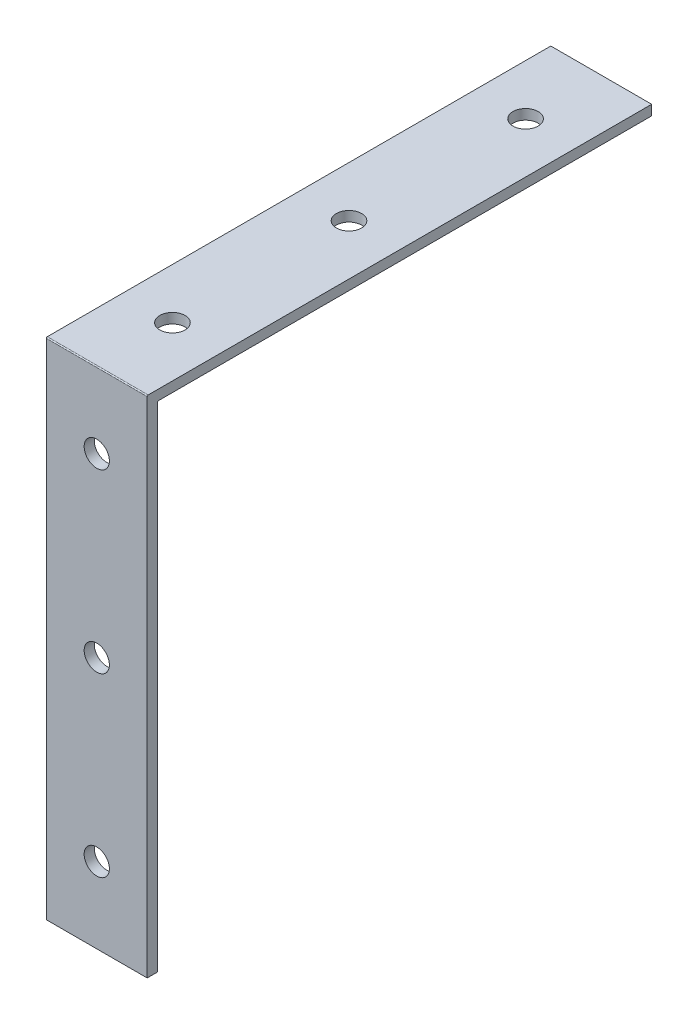
ISO-10303-21;
HEADER;
FILE_DESCRIPTION(('STEP AP214'),'2;1');
FILE_NAME('part.step','',(''),(''),'','','');
FILE_SCHEMA(('AUTOMOTIVE_DESIGN { 1 0 10303 214 1 1 1 1 }'));
ENDSEC;
DATA;
#1=APPLICATION_CONTEXT('core data for automotive mechanical design processes');
#2=APPLICATION_PROTOCOL_DEFINITION('international standard','automotive_design',2000,#1);
#3=PRODUCT_CONTEXT('',#1,'mechanical');
#4=PRODUCT('Part','Part','',(#3));
#5=PRODUCT_RELATED_PRODUCT_CATEGORY('part','',(#4));
#6=PRODUCT_DEFINITION_FORMATION('','',#4);
#7=PRODUCT_DEFINITION_CONTEXT('part definition',#1,'design');
#8=PRODUCT_DEFINITION('design','',#6,#7);
#9=PRODUCT_DEFINITION_SHAPE('','',#8);
#10=(LENGTH_UNIT() NAMED_UNIT(*) SI_UNIT(.MILLI.,.METRE.));
#11=(NAMED_UNIT(*) PLANE_ANGLE_UNIT() SI_UNIT($,.RADIAN.));
#12=(NAMED_UNIT(*) SI_UNIT($,.STERADIAN.) SOLID_ANGLE_UNIT());
#13=UNCERTAINTY_MEASURE_WITH_UNIT(LENGTH_MEASURE(1.E-05),#10,'distance_accuracy_value','');
#14=(GEOMETRIC_REPRESENTATION_CONTEXT(3) GLOBAL_UNCERTAINTY_ASSIGNED_CONTEXT((#13)) GLOBAL_UNIT_ASSIGNED_CONTEXT((#10,
#11,#12)) REPRESENTATION_CONTEXT('',''));
#15=CARTESIAN_POINT('',(0.,0.,0.));
#16=DIRECTION('',(0.,0.,1.));
#17=DIRECTION('',(1.,0.,0.));
#18=AXIS2_PLACEMENT_3D('',#15,#16,#17);
#19=CARTESIAN_POINT('',(20.,-2.,-100.));
#20=DIRECTION('',(0.,0.,1.));
#21=DIRECTION('',(1.,0.,0.));
#22=AXIS2_PLACEMENT_3D('',#19,#20,#21);
#23=PLANE('',#22);
#24=DIRECTION('',(0.,1.,0.));
#25=VECTOR('',#24,1.);
#26=CARTESIAN_POINT('',(0.,-2.,-100.));
#27=LINE('',#26,#25);
#28=CARTESIAN_POINT('',(0.,-2.,-100.));
#29=VERTEX_POINT('',#28);
#30=CARTESIAN_POINT('',(0.,0.,-100.));
#31=VERTEX_POINT('',#30);
#32=EDGE_CURVE('E129',#29,#31,#27,.T.);
#33=ORIENTED_EDGE('',*,*,#32,.T.);
#34=DIRECTION('',(-1.,0.,0.));
#35=VECTOR('',#34,1.);
#36=CARTESIAN_POINT('',(20.,0.,-100.));
#37=LINE('',#36,#35);
#38=CARTESIAN_POINT('',(20.,0.,-100.));
#39=VERTEX_POINT('',#38);
#40=EDGE_CURVE('E11',#39,#31,#37,.T.);
#41=ORIENTED_EDGE('',*,*,#40,.F.);
#42=DIRECTION('',(0.,1.,0.));
#43=VECTOR('',#42,1.);
#44=CARTESIAN_POINT('',(20.,-2.,-100.));
#45=LINE('',#44,#43);
#46=CARTESIAN_POINT('',(20.,-2.,-100.));
#47=VERTEX_POINT('',#46);
#48=EDGE_CURVE('E144',#47,#39,#45,.T.);
#49=ORIENTED_EDGE('',*,*,#48,.F.);
#50=DIRECTION('',(-1.,0.,0.));
#51=VECTOR('',#50,1.);
#52=CARTESIAN_POINT('',(20.,-2.,-100.));
#53=LINE('',#52,#51);
#54=EDGE_CURVE('E125',#47,#29,#53,.T.);
#55=ORIENTED_EDGE('',*,*,#54,.T.);
#56=EDGE_LOOP('',(#33,#41,#49,#55));
#57=FACE_BOUND('',#56,.T.);
#58=ADVANCED_FACE('F33',(#57),#23,.F.);
#59=CARTESIAN_POINT('',(20.,0.,-100.));
#60=DIRECTION('',(0.,-1.,0.));
#61=DIRECTION('',(0.,0.,-1.));
#62=AXIS2_PLACEMENT_3D('',#59,#60,#61);
#63=PLANE('',#62);
#64=CARTESIAN_POINT('',(10.,0.,-15.));
#65=DIRECTION('',(0.,1.,0.));
#66=DIRECTION('',(0.,0.,1.));
#67=AXIS2_PLACEMENT_3D('',#64,#65,#66);
#68=CIRCLE('',#67,2.50000000000001);
#69=CARTESIAN_POINT('',(10.,0.,-12.5));
#70=VERTEX_POINT('',#69);
#71=EDGE_CURVE('E191',#70,#70,#68,.T.);
#72=ORIENTED_EDGE('',*,*,#71,.F.);
#73=EDGE_LOOP('',(#72));
#74=FACE_BOUND('',#73,.T.);
#75=CARTESIAN_POINT('',(10.,0.,-50.));
#76=DIRECTION('',(0.,1.,0.));
#77=DIRECTION('',(0.,0.,1.));
#78=AXIS2_PLACEMENT_3D('',#75,#76,#77);
#79=CIRCLE('',#78,2.50000000000001);
#80=CARTESIAN_POINT('',(10.,0.,-47.5));
#81=VERTEX_POINT('',#80);
#82=EDGE_CURVE('E185',#81,#81,#79,.T.);
#83=ORIENTED_EDGE('',*,*,#82,.F.);
#84=EDGE_LOOP('',(#83));
#85=FACE_BOUND('',#84,.T.);
#86=CARTESIAN_POINT('',(10.,0.,-85.));
#87=DIRECTION('',(0.,1.,0.));
#88=DIRECTION('',(0.,0.,1.));
#89=AXIS2_PLACEMENT_3D('',#86,#87,#88);
#90=CIRCLE('',#89,2.50000000000001);
#91=CARTESIAN_POINT('',(10.,0.,-82.5));
#92=VERTEX_POINT('',#91);
#93=EDGE_CURVE('E179',#92,#92,#90,.T.);
#94=ORIENTED_EDGE('',*,*,#93,.F.);
#95=EDGE_LOOP('',(#94));
#96=FACE_BOUND('',#95,.T.);
#97=DIRECTION('',(0.,0.,1.));
#98=VECTOR('',#97,1.);
#99=CARTESIAN_POINT('',(0.,0.,-100.));
#100=LINE('',#99,#98);
#101=CARTESIAN_POINT('',(0.,0.,-0.199999999999996));
#102=VERTEX_POINT('',#101);
#103=EDGE_CURVE('E132',#31,#102,#100,.T.);
#104=ORIENTED_EDGE('',*,*,#103,.T.);
#105=DIRECTION('',(-1.,0.,0.));
#106=VECTOR('',#105,1.);
#107=CARTESIAN_POINT('',(20.,0.,-0.199999999999996));
#108=LINE('',#107,#106);
#109=CARTESIAN_POINT('',(20.,0.,-0.199999999999996));
#110=VERTEX_POINT('',#109);
#111=EDGE_CURVE('E41',#110,#102,#108,.T.);
#112=ORIENTED_EDGE('',*,*,#111,.F.);
#113=DIRECTION('',(0.,0.,1.));
#114=VECTOR('',#113,1.);
#115=CARTESIAN_POINT('',(20.,0.,-100.));
#116=LINE('',#115,#114);
#117=EDGE_CURVE('E92',#39,#110,#116,.T.);
#118=ORIENTED_EDGE('',*,*,#117,.F.);
#119=ORIENTED_EDGE('',*,*,#40,.T.);
#120=EDGE_LOOP('',(#104,#112,#118,#119));
#121=FACE_BOUND('',#120,.T.);
#122=ADVANCED_FACE('F243',(#74,#85,#96,#121),#63,.F.);
#123=CARTESIAN_POINT('',(20.,-0.200000000000005,-0.2));
#124=DIRECTION('',(-1.,0.,0.));
#125=DIRECTION('',(0.,0.,1.));
#126=AXIS2_PLACEMENT_3D('',#123,#124,#125);
#127=CYLINDRICAL_SURFACE('',#126,0.200000000000002);
#128=CARTESIAN_POINT('',(0.,-0.200000000000005,-0.2));
#129=DIRECTION('',(1.,0.,0.));
#130=DIRECTION('',(0.,0.,-1.));
#131=AXIS2_PLACEMENT_3D('',#128,#129,#130);
#132=CIRCLE('',#131,0.200000000000002);
#133=CARTESIAN_POINT('',(0.,-0.200000000000005,0.));
#134=VERTEX_POINT('',#133);
#135=EDGE_CURVE('E135',#102,#134,#132,.T.);
#136=ORIENTED_EDGE('',*,*,#135,.T.);
#137=DIRECTION('',(-1.,0.,0.));
#138=VECTOR('',#137,1.);
#139=CARTESIAN_POINT('',(20.,-0.200000000000005,0.));
#140=LINE('',#139,#138);
#141=CARTESIAN_POINT('',(20.,-0.200000000000005,0.));
#142=VERTEX_POINT('',#141);
#143=EDGE_CURVE('E151',#142,#134,#140,.T.);
#144=ORIENTED_EDGE('',*,*,#143,.F.);
#145=CARTESIAN_POINT('',(20.,-0.200000000000005,-0.2));
#146=DIRECTION('',(1.,0.,0.));
#147=DIRECTION('',(0.,0.,-1.));
#148=AXIS2_PLACEMENT_3D('',#145,#146,#147);
#149=CIRCLE('',#148,0.200000000000002);
#150=EDGE_CURVE('E159',#110,#142,#149,.T.);
#151=ORIENTED_EDGE('',*,*,#150,.F.);
#152=ORIENTED_EDGE('',*,*,#111,.T.);
#153=EDGE_LOOP('',(#136,#144,#151,#152));
#154=FACE_BOUND('',#153,.T.);
#155=ADVANCED_FACE('F157',(#154),#127,.T.);
#156=CARTESIAN_POINT('',(20.,-0.200000000000005,0.));
#157=DIRECTION('',(0.,0.,-1.));
#158=DIRECTION('',(0.,1.,0.));
#159=AXIS2_PLACEMENT_3D('',#156,#157,#158);
#160=PLANE('',#159);
#161=CARTESIAN_POINT('',(10.,-85.,0.));
#162=DIRECTION('',(0.,0.,1.));
#163=DIRECTION('',(1.,0.,0.));
#164=AXIS2_PLACEMENT_3D('',#161,#162,#163);
#165=CIRCLE('',#164,2.50000000000001);
#166=CARTESIAN_POINT('',(12.5,-85.,0.));
#167=VERTEX_POINT('',#166);
#168=EDGE_CURVE('E209',#167,#167,#165,.T.);
#169=ORIENTED_EDGE('',*,*,#168,.F.);
#170=EDGE_LOOP('',(#169));
#171=FACE_BOUND('',#170,.T.);
#172=CARTESIAN_POINT('',(10.,-50.,0.));
#173=DIRECTION('',(0.,0.,1.));
#174=DIRECTION('',(1.,0.,0.));
#175=AXIS2_PLACEMENT_3D('',#172,#173,#174);
#176=CIRCLE('',#175,2.50000000000001);
#177=CARTESIAN_POINT('',(12.5,-50.,0.));
#178=VERTEX_POINT('',#177);
#179=EDGE_CURVE('E203',#178,#178,#176,.T.);
#180=ORIENTED_EDGE('',*,*,#179,.F.);
#181=EDGE_LOOP('',(#180));
#182=FACE_BOUND('',#181,.T.);
#183=CARTESIAN_POINT('',(10.,-15.,0.));
#184=DIRECTION('',(0.,0.,1.));
#185=DIRECTION('',(1.,0.,0.));
#186=AXIS2_PLACEMENT_3D('',#183,#184,#185);
#187=CIRCLE('',#186,2.50000000000001);
#188=CARTESIAN_POINT('',(12.5,-15.,0.));
#189=VERTEX_POINT('',#188);
#190=EDGE_CURVE('E197',#189,#189,#187,.T.);
#191=ORIENTED_EDGE('',*,*,#190,.F.);
#192=EDGE_LOOP('',(#191));
#193=FACE_BOUND('',#192,.T.);
#194=DIRECTION('',(0.,-1.,0.));
#195=VECTOR('',#194,1.);
#196=CARTESIAN_POINT('',(0.,-0.200000000000005,0.));
#197=LINE('',#196,#195);
#198=CARTESIAN_POINT('',(0.,-100.,0.));
#199=VERTEX_POINT('',#198);
#200=EDGE_CURVE('E137',#134,#199,#197,.T.);
#201=ORIENTED_EDGE('',*,*,#200,.T.);
#202=DIRECTION('',(-1.,0.,0.));
#203=VECTOR('',#202,1.);
#204=CARTESIAN_POINT('',(20.,-100.,0.));
#205=LINE('',#204,#203);
#206=CARTESIAN_POINT('',(20.,-100.,0.));
#207=VERTEX_POINT('',#206);
#208=EDGE_CURVE('E148',#207,#199,#205,.T.);
#209=ORIENTED_EDGE('',*,*,#208,.F.);
#210=DIRECTION('',(0.,-1.,0.));
#211=VECTOR('',#210,1.);
#212=CARTESIAN_POINT('',(20.,-0.200000000000005,0.));
#213=LINE('',#212,#211);
#214=EDGE_CURVE('E171',#142,#207,#213,.T.);
#215=ORIENTED_EDGE('',*,*,#214,.F.);
#216=ORIENTED_EDGE('',*,*,#143,.T.);
#217=EDGE_LOOP('',(#201,#209,#215,#216));
#218=FACE_BOUND('',#217,.T.);
#219=ADVANCED_FACE('F167',(#171,#182,#193,#218),#160,.F.);
#220=CARTESIAN_POINT('',(20.,-100.,0.));
#221=DIRECTION('',(0.,1.,0.));
#222=DIRECTION('',(0.,0.,1.));
#223=AXIS2_PLACEMENT_3D('',#220,#221,#222);
#224=PLANE('',#223);
#225=DIRECTION('',(0.,0.,-1.));
#226=VECTOR('',#225,1.);
#227=CARTESIAN_POINT('',(0.,-100.,0.));
#228=LINE('',#227,#226);
#229=CARTESIAN_POINT('',(0.,-100.,-1.99999999999999));
#230=VERTEX_POINT('',#229);
#231=EDGE_CURVE('E139',#199,#230,#228,.T.);
#232=ORIENTED_EDGE('',*,*,#231,.T.);
#233=DIRECTION('',(-1.,0.,0.));
#234=VECTOR('',#233,1.);
#235=CARTESIAN_POINT('',(20.,-100.,-1.99999999999999));
#236=LINE('',#235,#234);
#237=CARTESIAN_POINT('',(20.,-100.,-1.99999999999999));
#238=VERTEX_POINT('',#237);
#239=EDGE_CURVE('E120',#238,#230,#236,.T.);
#240=ORIENTED_EDGE('',*,*,#239,.F.);
#241=DIRECTION('',(0.,0.,-1.));
#242=VECTOR('',#241,1.);
#243=CARTESIAN_POINT('',(20.,-100.,0.));
#244=LINE('',#243,#242);
#245=EDGE_CURVE('E111',#207,#238,#244,.T.);
#246=ORIENTED_EDGE('',*,*,#245,.F.);
#247=ORIENTED_EDGE('',*,*,#208,.T.);
#248=EDGE_LOOP('',(#232,#240,#246,#247));
#249=FACE_BOUND('',#248,.T.);
#250=ADVANCED_FACE('F170',(#249),#224,.F.);
#251=CARTESIAN_POINT('',(20.,-100.,-1.99999999999999));
#252=DIRECTION('',(0.,0.,1.));
#253=DIRECTION('',(1.,0.,0.));
#254=AXIS2_PLACEMENT_3D('',#251,#252,#253);
#255=PLANE('',#254);
#256=CARTESIAN_POINT('',(10.,-85.,-1.99999999999999));
#257=DIRECTION('',(0.,0.,1.));
#258=DIRECTION('',(1.,0.,0.));
#259=AXIS2_PLACEMENT_3D('',#256,#257,#258);
#260=CIRCLE('',#259,2.50000000000001);
#261=CARTESIAN_POINT('',(12.5,-85.,-1.99999999999999));
#262=VERTEX_POINT('',#261);
#263=EDGE_CURVE('E206',#262,#262,#260,.T.);
#264=ORIENTED_EDGE('',*,*,#263,.T.);
#265=EDGE_LOOP('',(#264));
#266=FACE_BOUND('',#265,.T.);
#267=CARTESIAN_POINT('',(10.,-50.,-1.99999999999999));
#268=DIRECTION('',(0.,0.,1.));
#269=DIRECTION('',(1.,0.,0.));
#270=AXIS2_PLACEMENT_3D('',#267,#268,#269);
#271=CIRCLE('',#270,2.50000000000001);
#272=CARTESIAN_POINT('',(12.5,-50.,-1.99999999999999));
#273=VERTEX_POINT('',#272);
#274=EDGE_CURVE('E200',#273,#273,#271,.T.);
#275=ORIENTED_EDGE('',*,*,#274,.T.);
#276=EDGE_LOOP('',(#275));
#277=FACE_BOUND('',#276,.T.);
#278=CARTESIAN_POINT('',(10.,-15.,-1.99999999999999));
#279=DIRECTION('',(0.,0.,1.));
#280=DIRECTION('',(1.,0.,0.));
#281=AXIS2_PLACEMENT_3D('',#278,#279,#280);
#282=CIRCLE('',#281,2.50000000000001);
#283=CARTESIAN_POINT('',(12.5,-15.,-1.99999999999999));
#284=VERTEX_POINT('',#283);
#285=EDGE_CURVE('E194',#284,#284,#282,.T.);
#286=ORIENTED_EDGE('',*,*,#285,.T.);
#287=EDGE_LOOP('',(#286));
#288=FACE_BOUND('',#287,.T.);
#289=DIRECTION('',(0.,1.,0.));
#290=VECTOR('',#289,1.);
#291=CARTESIAN_POINT('',(0.,-100.,-1.99999999999999));
#292=LINE('',#291,#290);
#293=CARTESIAN_POINT('',(0.,-2.20000000000001,-1.99999999999999));
#294=VERTEX_POINT('',#293);
#295=EDGE_CURVE('E119',#230,#294,#292,.T.);
#296=ORIENTED_EDGE('',*,*,#295,.T.);
#297=DIRECTION('',(-1.,0.,0.));
#298=VECTOR('',#297,1.);
#299=CARTESIAN_POINT('',(20.,-2.20000000000001,-1.99999999999999));
#300=LINE('',#299,#298);
#301=CARTESIAN_POINT('',(20.,-2.20000000000001,-1.99999999999999));
#302=VERTEX_POINT('',#301);
#303=EDGE_CURVE('E116',#302,#294,#300,.T.);
#304=ORIENTED_EDGE('',*,*,#303,.F.);
#305=DIRECTION('',(0.,1.,0.));
#306=VECTOR('',#305,1.);
#307=CARTESIAN_POINT('',(20.,-100.,-1.99999999999999));
#308=LINE('',#307,#306);
#309=EDGE_CURVE('E105',#238,#302,#308,.T.);
#310=ORIENTED_EDGE('',*,*,#309,.F.);
#311=ORIENTED_EDGE('',*,*,#239,.T.);
#312=EDGE_LOOP('',(#296,#304,#310,#311));
#313=FACE_BOUND('',#312,.T.);
#314=ADVANCED_FACE('F117',(#266,#277,#288,#313),#255,.F.);
#315=CARTESIAN_POINT('',(20.,-2.20000000000001,-2.19999999999999));
#316=DIRECTION('',(-1.,0.,0.));
#317=DIRECTION('',(0.,0.,1.));
#318=AXIS2_PLACEMENT_3D('',#315,#316,#317);
#319=CYLINDRICAL_SURFACE('',#318,0.2);
#320=CARTESIAN_POINT('',(0.,-2.20000000000001,-2.19999999999999));
#321=DIRECTION('',(-1.,0.,0.));
#322=DIRECTION('',(0.,0.,-1.));
#323=AXIS2_PLACEMENT_3D('',#320,#321,#322);
#324=CIRCLE('',#323,0.2);
#325=CARTESIAN_POINT('',(0.,-2.00000000000001,-2.19999999999999));
#326=VERTEX_POINT('',#325);
#327=EDGE_CURVE('E78',#294,#326,#324,.T.);
#328=ORIENTED_EDGE('',*,*,#327,.T.);
#329=DIRECTION('',(-1.,0.,0.));
#330=VECTOR('',#329,1.);
#331=CARTESIAN_POINT('',(20.,-2.00000000000001,-2.19999999999999));
#332=LINE('',#331,#330);
#333=CARTESIAN_POINT('',(20.,-2.00000000000001,-2.19999999999999));
#334=VERTEX_POINT('',#333);
#335=EDGE_CURVE('E121',#334,#326,#332,.T.);
#336=ORIENTED_EDGE('',*,*,#335,.F.);
#337=CARTESIAN_POINT('',(20.,-2.20000000000001,-2.19999999999999));
#338=DIRECTION('',(-1.,0.,0.));
#339=DIRECTION('',(0.,0.,-1.));
#340=AXIS2_PLACEMENT_3D('',#337,#338,#339);
#341=CIRCLE('',#340,0.2);
#342=EDGE_CURVE('E109',#302,#334,#341,.T.);
#343=ORIENTED_EDGE('',*,*,#342,.F.);
#344=ORIENTED_EDGE('',*,*,#303,.T.);
#345=EDGE_LOOP('',(#328,#336,#343,#344));
#346=FACE_BOUND('',#345,.T.);
#347=ADVANCED_FACE('F123',(#346),#319,.F.);
#348=CARTESIAN_POINT('',(20.,-2.00000000000001,-2.19999999999999));
#349=DIRECTION('',(0.,1.,0.));
#350=DIRECTION('',(0.,0.,1.));
#351=AXIS2_PLACEMENT_3D('',#348,#349,#350);
#352=PLANE('',#351);
#353=CARTESIAN_POINT('',(10.,-2.00000000000001,-15.));
#354=DIRECTION('',(0.,1.,0.));
#355=DIRECTION('',(0.,0.,1.));
#356=AXIS2_PLACEMENT_3D('',#353,#354,#355);
#357=CIRCLE('',#356,2.50000000000001);
#358=CARTESIAN_POINT('',(10.,-2.00000000000001,-12.5));
#359=VERTEX_POINT('',#358);
#360=EDGE_CURVE('E188',#359,#359,#357,.T.);
#361=ORIENTED_EDGE('',*,*,#360,.T.);
#362=EDGE_LOOP('',(#361));
#363=FACE_BOUND('',#362,.T.);
#364=CARTESIAN_POINT('',(10.,-2.,-50.));
#365=DIRECTION('',(0.,1.,0.));
#366=DIRECTION('',(0.,0.,1.));
#367=AXIS2_PLACEMENT_3D('',#364,#365,#366);
#368=CIRCLE('',#367,2.50000000000001);
#369=CARTESIAN_POINT('',(10.,-2.,-47.5));
#370=VERTEX_POINT('',#369);
#371=EDGE_CURVE('E182',#370,#370,#368,.T.);
#372=ORIENTED_EDGE('',*,*,#371,.T.);
#373=EDGE_LOOP('',(#372));
#374=FACE_BOUND('',#373,.T.);
#375=CARTESIAN_POINT('',(10.,-2.,-85.));
#376=DIRECTION('',(0.,1.,0.));
#377=DIRECTION('',(0.,0.,1.));
#378=AXIS2_PLACEMENT_3D('',#375,#376,#377);
#379=CIRCLE('',#378,2.50000000000001);
#380=CARTESIAN_POINT('',(10.,-2.,-82.5));
#381=VERTEX_POINT('',#380);
#382=EDGE_CURVE('E133',#381,#381,#379,.T.);
#383=ORIENTED_EDGE('',*,*,#382,.T.);
#384=EDGE_LOOP('',(#383));
#385=FACE_BOUND('',#384,.T.);
#386=DIRECTION('',(0.,0.,-1.));
#387=VECTOR('',#386,1.);
#388=CARTESIAN_POINT('',(0.,-2.00000000000001,-2.19999999999999));
#389=LINE('',#388,#387);
#390=EDGE_CURVE('E84',#326,#29,#389,.T.);
#391=ORIENTED_EDGE('',*,*,#390,.T.);
#392=ORIENTED_EDGE('',*,*,#54,.F.);
#393=DIRECTION('',(0.,0.,-1.));
#394=VECTOR('',#393,1.);
#395=CARTESIAN_POINT('',(20.,-2.00000000000001,-2.19999999999999));
#396=LINE('',#395,#394);
#397=EDGE_CURVE('E49',#334,#47,#396,.T.);
#398=ORIENTED_EDGE('',*,*,#397,.F.);
#399=ORIENTED_EDGE('',*,*,#335,.T.);
#400=EDGE_LOOP('',(#391,#392,#398,#399));
#401=FACE_BOUND('',#400,.T.);
#402=ADVANCED_FACE('F238',(#363,#374,#385,#401),#352,.F.);
#403=CARTESIAN_POINT('',(20.,-0.200000000000005,-0.2));
#404=DIRECTION('',(1.,0.,0.));
#405=DIRECTION('',(0.,0.,-1.));
#406=AXIS2_PLACEMENT_3D('',#403,#404,#405);
#407=PLANE('',#406);
#408=ORIENTED_EDGE('',*,*,#48,.T.);
#409=ORIENTED_EDGE('',*,*,#117,.T.);
#410=ORIENTED_EDGE('',*,*,#150,.T.);
#411=ORIENTED_EDGE('',*,*,#214,.T.);
#412=ORIENTED_EDGE('',*,*,#245,.T.);
#413=ORIENTED_EDGE('',*,*,#309,.T.);
#414=ORIENTED_EDGE('',*,*,#342,.T.);
#415=ORIENTED_EDGE('',*,*,#397,.T.);
#416=EDGE_LOOP('',(#408,#409,#410,#411,#412,#413,#414,#415));
#417=FACE_BOUND('',#416,.T.);
#418=ADVANCED_FACE('F107',(#417),#407,.T.);
#419=CARTESIAN_POINT('',(0.,-0.200000000000005,-0.2));
#420=DIRECTION('',(1.,0.,0.));
#421=DIRECTION('',(0.,0.,-1.));
#422=AXIS2_PLACEMENT_3D('',#419,#420,#421);
#423=PLANE('',#422);
#424=ORIENTED_EDGE('',*,*,#32,.F.);
#425=ORIENTED_EDGE('',*,*,#390,.F.);
#426=ORIENTED_EDGE('',*,*,#327,.F.);
#427=ORIENTED_EDGE('',*,*,#295,.F.);
#428=ORIENTED_EDGE('',*,*,#231,.F.);
#429=ORIENTED_EDGE('',*,*,#200,.F.);
#430=ORIENTED_EDGE('',*,*,#135,.F.);
#431=ORIENTED_EDGE('',*,*,#103,.F.);
#432=EDGE_LOOP('',(#424,#425,#426,#427,#428,#429,#430,#431));
#433=FACE_BOUND('',#432,.T.);
#434=ADVANCED_FACE('F163',(#433),#423,.F.);
#435=CARTESIAN_POINT('',(10.,0.,-85.));
#436=DIRECTION('',(0.,1.,0.));
#437=DIRECTION('',(0.,0.,1.));
#438=AXIS2_PLACEMENT_3D('',#435,#436,#437);
#439=CYLINDRICAL_SURFACE('',#438,2.50000000000001);
#440=ORIENTED_EDGE('',*,*,#93,.T.);
#441=EDGE_LOOP('',(#440));
#442=FACE_BOUND('',#441,.T.);
#443=ORIENTED_EDGE('',*,*,#382,.F.);
#444=EDGE_LOOP('',(#443));
#445=FACE_BOUND('',#444,.T.);
#446=ADVANCED_FACE('F261',(#442,#445),#439,.F.);
#447=CARTESIAN_POINT('',(10.,0.,-50.));
#448=DIRECTION('',(0.,1.,0.));
#449=DIRECTION('',(0.,0.,1.));
#450=AXIS2_PLACEMENT_3D('',#447,#448,#449);
#451=CYLINDRICAL_SURFACE('',#450,2.50000000000001);
#452=ORIENTED_EDGE('',*,*,#82,.T.);
#453=EDGE_LOOP('',(#452));
#454=FACE_BOUND('',#453,.T.);
#455=ORIENTED_EDGE('',*,*,#371,.F.);
#456=EDGE_LOOP('',(#455));
#457=FACE_BOUND('',#456,.T.);
#458=ADVANCED_FACE('F265',(#454,#457),#451,.F.);
#459=CARTESIAN_POINT('',(10.,0.,-15.));
#460=DIRECTION('',(0.,1.,0.));
#461=DIRECTION('',(0.,0.,1.));
#462=AXIS2_PLACEMENT_3D('',#459,#460,#461);
#463=CYLINDRICAL_SURFACE('',#462,2.50000000000001);
#464=ORIENTED_EDGE('',*,*,#71,.T.);
#465=EDGE_LOOP('',(#464));
#466=FACE_BOUND('',#465,.T.);
#467=ORIENTED_EDGE('',*,*,#360,.F.);
#468=EDGE_LOOP('',(#467));
#469=FACE_BOUND('',#468,.T.);
#470=ADVANCED_FACE('F227',(#466,#469),#463,.F.);
#471=CARTESIAN_POINT('',(10.,-15.,0.));
#472=DIRECTION('',(0.,0.,1.));
#473=DIRECTION('',(1.,0.,0.));
#474=AXIS2_PLACEMENT_3D('',#471,#472,#473);
#475=CYLINDRICAL_SURFACE('',#474,2.50000000000001);
#476=ORIENTED_EDGE('',*,*,#190,.T.);
#477=EDGE_LOOP('',(#476));
#478=FACE_BOUND('',#477,.T.);
#479=ORIENTED_EDGE('',*,*,#285,.F.);
#480=EDGE_LOOP('',(#479));
#481=FACE_BOUND('',#480,.T.);
#482=ADVANCED_FACE('F223',(#478,#481),#475,.F.);
#483=CARTESIAN_POINT('',(10.,-50.,0.));
#484=DIRECTION('',(0.,0.,1.));
#485=DIRECTION('',(1.,0.,0.));
#486=AXIS2_PLACEMENT_3D('',#483,#484,#485);
#487=CYLINDRICAL_SURFACE('',#486,2.50000000000001);
#488=ORIENTED_EDGE('',*,*,#179,.T.);
#489=EDGE_LOOP('',(#488));
#490=FACE_BOUND('',#489,.T.);
#491=ORIENTED_EDGE('',*,*,#274,.F.);
#492=EDGE_LOOP('',(#491));
#493=FACE_BOUND('',#492,.T.);
#494=ADVANCED_FACE('F226',(#490,#493),#487,.F.);
#495=CARTESIAN_POINT('',(10.,-85.,0.));
#496=DIRECTION('',(0.,0.,1.));
#497=DIRECTION('',(1.,0.,0.));
#498=AXIS2_PLACEMENT_3D('',#495,#496,#497);
#499=CYLINDRICAL_SURFACE('',#498,2.50000000000001);
#500=ORIENTED_EDGE('',*,*,#168,.T.);
#501=EDGE_LOOP('',(#500));
#502=FACE_BOUND('',#501,.T.);
#503=ORIENTED_EDGE('',*,*,#263,.F.);
#504=EDGE_LOOP('',(#503));
#505=FACE_BOUND('',#504,.T.);
#506=ADVANCED_FACE('F213',(#502,#505),#499,.F.);
#507=CLOSED_SHELL('',(#58,#122,#155,#219,#250,#314,#347,#402,#418,#434,#446,#458,#470,#482,#494,#506));
#508=MANIFOLD_SOLID_BREP('B2',#507);
#509=ADVANCED_BREP_SHAPE_REPRESENTATION('',(#18,#508),#14);
#510=SHAPE_DEFINITION_REPRESENTATION(#9,#509);
ENDSEC;
END-ISO-10303-21;
